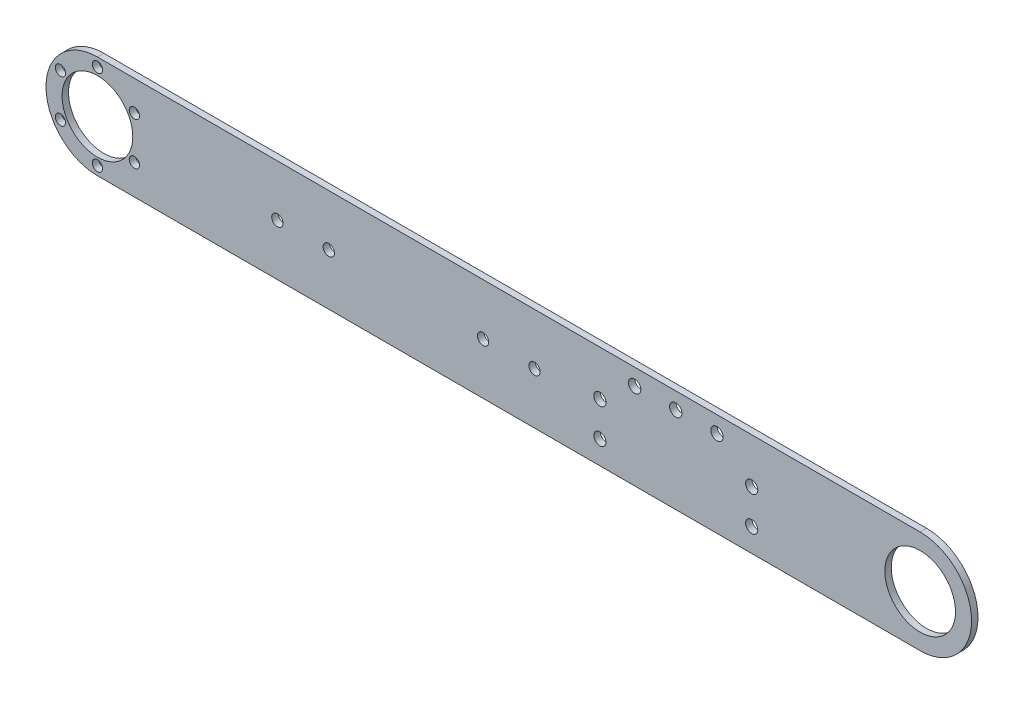
ISO-10303-21;
HEADER;
FILE_DESCRIPTION(('STEP AP214'),'2;1');
FILE_NAME('part.step','',(''),(''),'','','');
FILE_SCHEMA(('AUTOMOTIVE_DESIGN { 1 0 10303 214 1 1 1 1 }'));
ENDSEC;
DATA;
#1=APPLICATION_CONTEXT('core data for automotive mechanical design processes');
#2=APPLICATION_PROTOCOL_DEFINITION('international standard','automotive_design',2000,#1);
#3=PRODUCT_CONTEXT('',#1,'mechanical');
#4=PRODUCT('Part','Part','',(#3));
#5=PRODUCT_RELATED_PRODUCT_CATEGORY('part','',(#4));
#6=PRODUCT_DEFINITION_FORMATION('','',#4);
#7=PRODUCT_DEFINITION_CONTEXT('part definition',#1,'design');
#8=PRODUCT_DEFINITION('design','',#6,#7);
#9=PRODUCT_DEFINITION_SHAPE('','',#8);
#10=(LENGTH_UNIT() NAMED_UNIT(*) SI_UNIT(.MILLI.,.METRE.));
#11=(NAMED_UNIT(*) PLANE_ANGLE_UNIT() SI_UNIT($,.RADIAN.));
#12=(NAMED_UNIT(*) SI_UNIT($,.STERADIAN.) SOLID_ANGLE_UNIT());
#13=UNCERTAINTY_MEASURE_WITH_UNIT(LENGTH_MEASURE(1.E-05),#10,'distance_accuracy_value','');
#14=(GEOMETRIC_REPRESENTATION_CONTEXT(3) GLOBAL_UNCERTAINTY_ASSIGNED_CONTEXT((#13)) GLOBAL_UNIT_ASSIGNED_CONTEXT((#10,
#11,#12)) REPRESENTATION_CONTEXT('',''));
#15=CARTESIAN_POINT('',(0.,0.,0.));
#16=DIRECTION('',(0.,0.,1.));
#17=DIRECTION('',(1.,0.,0.));
#18=AXIS2_PLACEMENT_3D('',#15,#16,#17);
#19=CARTESIAN_POINT('',(0.,25.4,3.175));
#20=DIRECTION('',(0.,0.,-1.));
#21=DIRECTION('',(-1.,0.,0.));
#22=AXIS2_PLACEMENT_3D('',#19,#20,#21);
#23=CYLINDRICAL_SURFACE('',#22,25.4);
#24=CARTESIAN_POINT('',(0.,25.4,0.));
#25=DIRECTION('',(0.,0.,1.));
#26=DIRECTION('',(1.,0.,0.));
#27=AXIS2_PLACEMENT_3D('',#24,#25,#26);
#28=CIRCLE('',#27,25.4);
#29=CARTESIAN_POINT('',(0.,50.8,0.));
#30=VERTEX_POINT('',#29);
#31=CARTESIAN_POINT('',(0.,0.,0.));
#32=VERTEX_POINT('',#31);
#33=EDGE_CURVE('E96',#30,#32,#28,.T.);
#34=ORIENTED_EDGE('',*,*,#33,.T.);
#35=DIRECTION('',(0.,0.,-1.));
#36=VECTOR('',#35,1.);
#37=CARTESIAN_POINT('',(0.,0.,3.175));
#38=LINE('',#37,#36);
#39=CARTESIAN_POINT('',(0.,0.,3.175));
#40=VERTEX_POINT('',#39);
#41=EDGE_CURVE('E11',#40,#32,#38,.T.);
#42=ORIENTED_EDGE('',*,*,#41,.F.);
#43=CARTESIAN_POINT('',(0.,25.4,3.175));
#44=DIRECTION('',(0.,0.,1.));
#45=DIRECTION('',(1.,0.,0.));
#46=AXIS2_PLACEMENT_3D('',#43,#44,#45);
#47=CIRCLE('',#46,25.4);
#48=CARTESIAN_POINT('',(0.,50.8,3.175));
#49=VERTEX_POINT('',#48);
#50=EDGE_CURVE('E84',#49,#40,#47,.T.);
#51=ORIENTED_EDGE('',*,*,#50,.F.);
#52=DIRECTION('',(0.,0.,-1.));
#53=VECTOR('',#52,1.);
#54=CARTESIAN_POINT('',(0.,50.8,3.175));
#55=LINE('',#54,#53);
#56=EDGE_CURVE('E92',#49,#30,#55,.T.);
#57=ORIENTED_EDGE('',*,*,#56,.T.);
#58=EDGE_LOOP('',(#34,#42,#51,#57));
#59=FACE_BOUND('',#58,.T.);
#60=ADVANCED_FACE('F33',(#59),#23,.T.);
#61=CARTESIAN_POINT('',(0.,0.,3.175));
#62=DIRECTION('',(0.,1.,0.));
#63=DIRECTION('',(0.,0.,1.));
#64=AXIS2_PLACEMENT_3D('',#61,#62,#63);
#65=PLANE('',#64);
#66=DIRECTION('',(1.,0.,0.));
#67=VECTOR('',#66,1.);
#68=CARTESIAN_POINT('',(0.,0.,0.));
#69=LINE('',#68,#67);
#70=CARTESIAN_POINT('',(406.4,0.,0.));
#71=VERTEX_POINT('',#70);
#72=EDGE_CURVE('E88',#32,#71,#69,.T.);
#73=ORIENTED_EDGE('',*,*,#72,.T.);
#74=DIRECTION('',(0.,0.,-1.));
#75=VECTOR('',#74,1.);
#76=CARTESIAN_POINT('',(406.4,0.,3.175));
#77=LINE('',#76,#75);
#78=CARTESIAN_POINT('',(406.4,0.,3.175));
#79=VERTEX_POINT('',#78);
#80=EDGE_CURVE('E41',#79,#71,#77,.T.);
#81=ORIENTED_EDGE('',*,*,#80,.F.);
#82=DIRECTION('',(1.,0.,0.));
#83=VECTOR('',#82,1.);
#84=CARTESIAN_POINT('',(0.,0.,3.175));
#85=LINE('',#84,#83);
#86=EDGE_CURVE('E79',#40,#79,#85,.T.);
#87=ORIENTED_EDGE('',*,*,#86,.F.);
#88=ORIENTED_EDGE('',*,*,#41,.T.);
#89=EDGE_LOOP('',(#73,#81,#87,#88));
#90=FACE_BOUND('',#89,.T.);
#91=ADVANCED_FACE('F87',(#90),#65,.F.);
#92=CARTESIAN_POINT('',(406.4,25.4,3.175));
#93=DIRECTION('',(0.,0.,-1.));
#94=DIRECTION('',(-1.,0.,0.));
#95=AXIS2_PLACEMENT_3D('',#92,#93,#94);
#96=CYLINDRICAL_SURFACE('',#95,25.4);
#97=CARTESIAN_POINT('',(406.4,25.4,0.));
#98=DIRECTION('',(0.,0.,1.));
#99=DIRECTION('',(1.,0.,0.));
#100=AXIS2_PLACEMENT_3D('',#97,#98,#99);
#101=CIRCLE('',#100,25.4);
#102=CARTESIAN_POINT('',(406.4,50.8,0.));
#103=VERTEX_POINT('',#102);
#104=EDGE_CURVE('E66',#71,#103,#101,.T.);
#105=ORIENTED_EDGE('',*,*,#104,.T.);
#106=DIRECTION('',(0.,0.,-1.));
#107=VECTOR('',#106,1.);
#108=CARTESIAN_POINT('',(406.4,50.8,3.175));
#109=LINE('',#108,#107);
#110=CARTESIAN_POINT('',(406.4,50.8,3.175));
#111=VERTEX_POINT('',#110);
#112=EDGE_CURVE('E89',#111,#103,#109,.T.);
#113=ORIENTED_EDGE('',*,*,#112,.F.);
#114=CARTESIAN_POINT('',(406.4,25.4,3.175));
#115=DIRECTION('',(0.,0.,1.));
#116=DIRECTION('',(1.,0.,0.));
#117=AXIS2_PLACEMENT_3D('',#114,#115,#116);
#118=CIRCLE('',#117,25.4);
#119=EDGE_CURVE('E82',#79,#111,#118,.T.);
#120=ORIENTED_EDGE('',*,*,#119,.F.);
#121=ORIENTED_EDGE('',*,*,#80,.T.);
#122=EDGE_LOOP('',(#105,#113,#120,#121));
#123=FACE_BOUND('',#122,.T.);
#124=ADVANCED_FACE('F90',(#123),#96,.T.);
#125=CARTESIAN_POINT('',(0.,50.8,3.175));
#126=DIRECTION('',(0.,-1.,0.));
#127=DIRECTION('',(0.,0.,-1.));
#128=AXIS2_PLACEMENT_3D('',#125,#126,#127);
#129=PLANE('',#128);
#130=DIRECTION('',(-1.,0.,0.));
#131=VECTOR('',#130,1.);
#132=CARTESIAN_POINT('',(0.,50.8,0.));
#133=LINE('',#132,#131);
#134=EDGE_CURVE('E72',#103,#30,#133,.T.);
#135=ORIENTED_EDGE('',*,*,#134,.T.);
#136=ORIENTED_EDGE('',*,*,#56,.F.);
#137=DIRECTION('',(-1.,0.,0.));
#138=VECTOR('',#137,1.);
#139=CARTESIAN_POINT('',(0.,50.8,3.175));
#140=LINE('',#139,#138);
#141=EDGE_CURVE('E49',#111,#49,#140,.T.);
#142=ORIENTED_EDGE('',*,*,#141,.F.);
#143=ORIENTED_EDGE('',*,*,#112,.T.);
#144=EDGE_LOOP('',(#135,#136,#142,#143));
#145=FACE_BOUND('',#144,.T.);
#146=ADVANCED_FACE('F104',(#145),#129,.F.);
#147=CARTESIAN_POINT('',(0.,25.4,3.175));
#148=DIRECTION('',(0.,0.,1.));
#149=DIRECTION('',(1.,0.,0.));
#150=AXIS2_PLACEMENT_3D('',#147,#148,#149);
#151=PLANE('',#150);
#152=CARTESIAN_POINT('',(323.195176825481,28.5432896283966,3.175));
#153=DIRECTION('',(0.,0.,1.));
#154=DIRECTION('',(1.,0.,0.));
#155=AXIS2_PLACEMENT_3D('',#152,#153,#154);
#156=CIRCLE('',#155,3.00000000000057);
#157=CARTESIAN_POINT('',(326.195176825481,28.5432896283966,3.175));
#158=VERTEX_POINT('',#157);
#159=EDGE_CURVE('E213',#158,#158,#156,.T.);
#160=ORIENTED_EDGE('',*,*,#159,.F.);
#161=EDGE_LOOP('',(#160));
#162=FACE_BOUND('',#161,.T.);
#163=CARTESIAN_POINT('',(248.195176825481,11.5432896283965,3.175));
#164=DIRECTION('',(0.,0.,1.));
#165=DIRECTION('',(1.,0.,0.));
#166=AXIS2_PLACEMENT_3D('',#163,#164,#165);
#167=CIRCLE('',#166,3.0000000000006);
#168=CARTESIAN_POINT('',(251.195176825481,11.5432896283965,3.175));
#169=VERTEX_POINT('',#168);
#170=EDGE_CURVE('E206',#169,#169,#167,.T.);
#171=ORIENTED_EDGE('',*,*,#170,.F.);
#172=EDGE_LOOP('',(#171));
#173=FACE_BOUND('',#172,.T.);
#174=CARTESIAN_POINT('',(248.195176825486,28.5432896283815,3.175));
#175=DIRECTION('',(0.,0.,1.));
#176=DIRECTION('',(1.,0.,0.));
#177=AXIS2_PLACEMENT_3D('',#174,#175,#176);
#178=CIRCLE('',#177,2.99999999999906);
#179=CARTESIAN_POINT('',(251.195176825485,28.5432896283815,3.175));
#180=VERTEX_POINT('',#179);
#181=EDGE_CURVE('E218',#180,#180,#178,.T.);
#182=ORIENTED_EDGE('',*,*,#181,.F.);
#183=EDGE_LOOP('',(#182));
#184=FACE_BOUND('',#183,.T.);
#185=CARTESIAN_POINT('',(323.195176825481,11.5432896283966,3.175));
#186=DIRECTION('',(0.,0.,1.));
#187=DIRECTION('',(1.,0.,0.));
#188=AXIS2_PLACEMENT_3D('',#185,#186,#187);
#189=CIRCLE('',#188,3.0000000000003);
#190=CARTESIAN_POINT('',(326.195176825481,11.5432896283966,3.175));
#191=VERTEX_POINT('',#190);
#192=EDGE_CURVE('E200',#191,#191,#189,.T.);
#193=ORIENTED_EDGE('',*,*,#192,.F.);
#194=EDGE_LOOP('',(#193));
#195=FACE_BOUND('',#194,.T.);
#196=CARTESIAN_POINT('',(306.015176825481,42.672,3.175));
#197=DIRECTION('',(0.,0.,1.));
#198=DIRECTION('',(1.,0.,0.));
#199=AXIS2_PLACEMENT_3D('',#196,#197,#198);
#200=CIRCLE('',#199,3.04800000000001);
#201=CARTESIAN_POINT('',(309.063176825481,42.672,3.175));
#202=VERTEX_POINT('',#201);
#203=EDGE_CURVE('E195',#202,#202,#200,.T.);
#204=ORIENTED_EDGE('',*,*,#203,.F.);
#205=EDGE_LOOP('',(#204));
#206=FACE_BOUND('',#205,.T.);
#207=CARTESIAN_POINT('',(285.695176825481,42.672,3.175));
#208=DIRECTION('',(0.,0.,1.));
#209=DIRECTION('',(1.,0.,0.));
#210=AXIS2_PLACEMENT_3D('',#207,#208,#209);
#211=CIRCLE('',#210,3.04800000000001);
#212=CARTESIAN_POINT('',(288.743176825481,42.672,3.175));
#213=VERTEX_POINT('',#212);
#214=EDGE_CURVE('E189',#213,#213,#211,.T.);
#215=ORIENTED_EDGE('',*,*,#214,.F.);
#216=EDGE_LOOP('',(#215));
#217=FACE_BOUND('',#216,.T.);
#218=CARTESIAN_POINT('',(265.375176825481,42.672,3.175));
#219=DIRECTION('',(0.,0.,1.));
#220=DIRECTION('',(1.,0.,0.));
#221=AXIS2_PLACEMENT_3D('',#218,#219,#220);
#222=CIRCLE('',#221,3.04800000000001);
#223=CARTESIAN_POINT('',(268.423176825481,42.672,3.175));
#224=VERTEX_POINT('',#223);
#225=EDGE_CURVE('E182',#224,#224,#222,.T.);
#226=ORIENTED_EDGE('',*,*,#225,.F.);
#227=EDGE_LOOP('',(#226));
#228=FACE_BOUND('',#227,.T.);
#229=CARTESIAN_POINT('',(88.9000000000006,25.4000000000066,3.175));
#230=DIRECTION('',(0.,0.,1.));
#231=DIRECTION('',(1.,0.,0.));
#232=AXIS2_PLACEMENT_3D('',#229,#230,#231);
#233=CIRCLE('',#232,2.79399999999336);
#234=CARTESIAN_POINT('',(91.693999999994,25.4000000000066,3.175));
#235=VERTEX_POINT('',#234);
#236=EDGE_CURVE('E177',#235,#235,#233,.T.);
#237=ORIENTED_EDGE('',*,*,#236,.F.);
#238=EDGE_LOOP('',(#237));
#239=FACE_BOUND('',#238,.T.);
#240=CARTESIAN_POINT('',(114.300000000001,25.4000000000066,3.175));
#241=DIRECTION('',(0.,0.,1.));
#242=DIRECTION('',(1.,0.,0.));
#243=AXIS2_PLACEMENT_3D('',#240,#241,#242);
#244=CIRCLE('',#243,2.79399999999335);
#245=CARTESIAN_POINT('',(117.093999999994,25.4000000000066,3.175));
#246=VERTEX_POINT('',#245);
#247=EDGE_CURVE('E171',#246,#246,#244,.T.);
#248=ORIENTED_EDGE('',*,*,#247,.F.);
#249=EDGE_LOOP('',(#248));
#250=FACE_BOUND('',#249,.T.);
#251=CARTESIAN_POINT('',(190.500000000001,25.4000000000066,3.175));
#252=DIRECTION('',(0.,0.,1.));
#253=DIRECTION('',(1.,0.,0.));
#254=AXIS2_PLACEMENT_3D('',#251,#252,#253);
#255=CIRCLE('',#254,2.79399999999332);
#256=CARTESIAN_POINT('',(193.293999999994,25.4000000000066,3.175));
#257=VERTEX_POINT('',#256);
#258=EDGE_CURVE('E165',#257,#257,#255,.T.);
#259=ORIENTED_EDGE('',*,*,#258,.F.);
#260=EDGE_LOOP('',(#259));
#261=FACE_BOUND('',#260,.T.);
#262=CARTESIAN_POINT('',(215.900000000001,25.4000000000066,3.175));
#263=DIRECTION('',(0.,0.,1.));
#264=DIRECTION('',(1.,0.,0.));
#265=AXIS2_PLACEMENT_3D('',#262,#263,#264);
#266=CIRCLE('',#265,2.79399999999332);
#267=CARTESIAN_POINT('',(218.693999999994,25.4000000000066,3.175));
#268=VERTEX_POINT('',#267);
#269=EDGE_CURVE('E158',#268,#268,#266,.T.);
#270=ORIENTED_EDGE('',*,*,#269,.F.);
#271=EDGE_LOOP('',(#270));
#272=FACE_BOUND('',#271,.T.);
#273=CARTESIAN_POINT('',(18.2575475625839,35.9410000000005,3.175));
#274=DIRECTION('',(0.,0.,1.));
#275=DIRECTION('',(1.,0.,0.));
#276=AXIS2_PLACEMENT_3D('',#273,#274,#275);
#277=CIRCLE('',#276,2.55269999999999);
#278=CARTESIAN_POINT('',(20.8102475625838,35.9410000000005,3.175));
#279=VERTEX_POINT('',#278);
#280=EDGE_CURVE('E154',#279,#279,#277,.T.);
#281=ORIENTED_EDGE('',*,*,#280,.F.);
#282=EDGE_LOOP('',(#281));
#283=FACE_BOUND('',#282,.T.);
#284=CARTESIAN_POINT('',(18.2575475625844,14.8590000000004,3.175));
#285=DIRECTION('',(0.,0.,1.));
#286=DIRECTION('',(1.,0.,0.));
#287=AXIS2_PLACEMENT_3D('',#284,#285,#286);
#288=CIRCLE('',#287,2.55269999999999);
#289=CARTESIAN_POINT('',(20.8102475625844,14.8590000000004,3.175));
#290=VERTEX_POINT('',#289);
#291=EDGE_CURVE('E148',#290,#290,#288,.T.);
#292=ORIENTED_EDGE('',*,*,#291,.F.);
#293=EDGE_LOOP('',(#292));
#294=FACE_BOUND('',#293,.T.);
#295=CARTESIAN_POINT('',(1.04083093572472E-12,4.318,3.175));
#296=DIRECTION('',(0.,0.,1.));
#297=DIRECTION('',(1.,0.,0.));
#298=AXIS2_PLACEMENT_3D('',#295,#296,#297);
#299=CIRCLE('',#298,2.55269999999999);
#300=CARTESIAN_POINT('',(2.55270000000103,4.318,3.175));
#301=VERTEX_POINT('',#300);
#302=EDGE_CURVE('E142',#301,#301,#299,.T.);
#303=ORIENTED_EDGE('',*,*,#302,.F.);
#304=EDGE_LOOP('',(#303));
#305=FACE_BOUND('',#304,.T.);
#306=CARTESIAN_POINT('',(-18.2575475625827,14.8589999999997,3.175));
#307=DIRECTION('',(0.,0.,1.));
#308=DIRECTION('',(1.,0.,0.));
#309=AXIS2_PLACEMENT_3D('',#306,#307,#308);
#310=CIRCLE('',#309,2.55269999999999);
#311=CARTESIAN_POINT('',(-15.7048475625828,14.8589999999997,3.175));
#312=VERTEX_POINT('',#311);
#313=EDGE_CURVE('E136',#312,#312,#310,.T.);
#314=ORIENTED_EDGE('',*,*,#313,.F.);
#315=EDGE_LOOP('',(#314));
#316=FACE_BOUND('',#315,.T.);
#317=CARTESIAN_POINT('',(-18.2575475625831,35.9409999999997,3.175));
#318=DIRECTION('',(0.,0.,1.));
#319=DIRECTION('',(1.,0.,0.));
#320=AXIS2_PLACEMENT_3D('',#317,#318,#319);
#321=CIRCLE('',#320,2.55269999999999);
#322=CARTESIAN_POINT('',(-15.7048475625831,35.9409999999997,3.175));
#323=VERTEX_POINT('',#322);
#324=EDGE_CURVE('E130',#323,#323,#321,.T.);
#325=ORIENTED_EDGE('',*,*,#324,.F.);
#326=EDGE_LOOP('',(#325));
#327=FACE_BOUND('',#326,.T.);
#328=CARTESIAN_POINT('',(0.,46.482,3.175));
#329=DIRECTION('',(0.,0.,1.));
#330=DIRECTION('',(1.,0.,0.));
#331=AXIS2_PLACEMENT_3D('',#328,#329,#330);
#332=CIRCLE('',#331,2.55269999999999);
#333=CARTESIAN_POINT('',(2.55269999999999,46.482,3.175));
#334=VERTEX_POINT('',#333);
#335=EDGE_CURVE('E124',#334,#334,#332,.T.);
#336=ORIENTED_EDGE('',*,*,#335,.F.);
#337=EDGE_LOOP('',(#336));
#338=FACE_BOUND('',#337,.T.);
#339=CARTESIAN_POINT('',(0.,25.4,3.175));
#340=DIRECTION('',(0.,0.,1.));
#341=DIRECTION('',(1.,0.,0.));
#342=AXIS2_PLACEMENT_3D('',#339,#340,#341);
#343=CIRCLE('',#342,17.4625);
#344=CARTESIAN_POINT('',(17.4625,25.4,3.175));
#345=VERTEX_POINT('',#344);
#346=EDGE_CURVE('E117',#345,#345,#343,.T.);
#347=ORIENTED_EDGE('',*,*,#346,.F.);
#348=EDGE_LOOP('',(#347));
#349=FACE_BOUND('',#348,.T.);
#350=CARTESIAN_POINT('',(406.4,25.4,3.175));
#351=DIRECTION('',(0.,0.,1.));
#352=DIRECTION('',(1.,0.,0.));
#353=AXIS2_PLACEMENT_3D('',#350,#351,#352);
#354=CIRCLE('',#353,17.4625);
#355=CARTESIAN_POINT('',(423.8625,25.4,3.175));
#356=VERTEX_POINT('',#355);
#357=EDGE_CURVE('E110',#356,#356,#354,.T.);
#358=ORIENTED_EDGE('',*,*,#357,.F.);
#359=EDGE_LOOP('',(#358));
#360=FACE_BOUND('',#359,.T.);
#361=ORIENTED_EDGE('',*,*,#50,.T.);
#362=ORIENTED_EDGE('',*,*,#86,.T.);
#363=ORIENTED_EDGE('',*,*,#119,.T.);
#364=ORIENTED_EDGE('',*,*,#141,.T.);
#365=EDGE_LOOP('',(#361,#362,#363,#364));
#366=FACE_BOUND('',#365,.T.);
#367=ADVANCED_FACE('F80',(#162,#173,#184,#195,#206,#217,#228,#239,#250,#261,#272,#283,#294,#305,
#316,#327,#338,#349,#360,#366),#151,.T.);
#368=CARTESIAN_POINT('',(0.,25.4,0.));
#369=DIRECTION('',(0.,0.,1.));
#370=DIRECTION('',(1.,0.,0.));
#371=AXIS2_PLACEMENT_3D('',#368,#369,#370);
#372=PLANE('',#371);
#373=CARTESIAN_POINT('',(323.195176825481,28.5432896283966,0.));
#374=DIRECTION('',(0.,0.,1.));
#375=DIRECTION('',(1.,0.,0.));
#376=AXIS2_PLACEMENT_3D('',#373,#374,#375);
#377=CIRCLE('',#376,3.00000000000057);
#378=CARTESIAN_POINT('',(326.195176825481,28.5432896283966,0.));
#379=VERTEX_POINT('',#378);
#380=EDGE_CURVE('E203',#379,#379,#377,.T.);
#381=ORIENTED_EDGE('',*,*,#380,.T.);
#382=EDGE_LOOP('',(#381));
#383=FACE_BOUND('',#382,.T.);
#384=CARTESIAN_POINT('',(248.195176825481,11.5432896283965,0.));
#385=DIRECTION('',(0.,0.,1.));
#386=DIRECTION('',(1.,0.,0.));
#387=AXIS2_PLACEMENT_3D('',#384,#385,#386);
#388=CIRCLE('',#387,3.0000000000006);
#389=CARTESIAN_POINT('',(251.195176825481,11.5432896283965,0.));
#390=VERTEX_POINT('',#389);
#391=EDGE_CURVE('E209',#390,#390,#388,.T.);
#392=ORIENTED_EDGE('',*,*,#391,.T.);
#393=EDGE_LOOP('',(#392));
#394=FACE_BOUND('',#393,.T.);
#395=CARTESIAN_POINT('',(248.195176825486,28.5432896283815,0.));
#396=DIRECTION('',(0.,0.,1.));
#397=DIRECTION('',(1.,0.,0.));
#398=AXIS2_PLACEMENT_3D('',#395,#396,#397);
#399=CIRCLE('',#398,2.99999999999906);
#400=CARTESIAN_POINT('',(251.195176825485,28.5432896283815,0.));
#401=VERTEX_POINT('',#400);
#402=EDGE_CURVE('E210',#401,#401,#399,.T.);
#403=ORIENTED_EDGE('',*,*,#402,.T.);
#404=EDGE_LOOP('',(#403));
#405=FACE_BOUND('',#404,.T.);
#406=CARTESIAN_POINT('',(323.195176825481,11.5432896283966,0.));
#407=DIRECTION('',(0.,0.,1.));
#408=DIRECTION('',(1.,0.,0.));
#409=AXIS2_PLACEMENT_3D('',#406,#407,#408);
#410=CIRCLE('',#409,3.0000000000003);
#411=CARTESIAN_POINT('',(326.195176825481,11.5432896283966,0.));
#412=VERTEX_POINT('',#411);
#413=EDGE_CURVE('E186',#412,#412,#410,.T.);
#414=ORIENTED_EDGE('',*,*,#413,.T.);
#415=EDGE_LOOP('',(#414));
#416=FACE_BOUND('',#415,.T.);
#417=CARTESIAN_POINT('',(306.015176825481,42.672,0.));
#418=DIRECTION('',(0.,0.,1.));
#419=DIRECTION('',(1.,0.,0.));
#420=AXIS2_PLACEMENT_3D('',#417,#418,#419);
#421=CIRCLE('',#420,3.04800000000001);
#422=CARTESIAN_POINT('',(309.063176825481,42.672,0.));
#423=VERTEX_POINT('',#422);
#424=EDGE_CURVE('E162',#423,#423,#421,.T.);
#425=ORIENTED_EDGE('',*,*,#424,.T.);
#426=EDGE_LOOP('',(#425));
#427=FACE_BOUND('',#426,.T.);
#428=CARTESIAN_POINT('',(285.695176825481,42.672,0.));
#429=DIRECTION('',(0.,0.,1.));
#430=DIRECTION('',(1.,0.,0.));
#431=AXIS2_PLACEMENT_3D('',#428,#429,#430);
#432=CIRCLE('',#431,3.04800000000001);
#433=CARTESIAN_POINT('',(288.743176825481,42.672,0.));
#434=VERTEX_POINT('',#433);
#435=EDGE_CURVE('E192',#434,#434,#432,.T.);
#436=ORIENTED_EDGE('',*,*,#435,.T.);
#437=EDGE_LOOP('',(#436));
#438=FACE_BOUND('',#437,.T.);
#439=CARTESIAN_POINT('',(265.375176825481,42.672,0.));
#440=DIRECTION('',(0.,0.,1.));
#441=DIRECTION('',(1.,0.,0.));
#442=AXIS2_PLACEMENT_3D('',#439,#440,#441);
#443=CIRCLE('',#442,3.04800000000001);
#444=CARTESIAN_POINT('',(268.423176825481,42.672,0.));
#445=VERTEX_POINT('',#444);
#446=EDGE_CURVE('E185',#445,#445,#443,.T.);
#447=ORIENTED_EDGE('',*,*,#446,.T.);
#448=EDGE_LOOP('',(#447));
#449=FACE_BOUND('',#448,.T.);
#450=CARTESIAN_POINT('',(88.9000000000006,25.4000000000066,0.));
#451=DIRECTION('',(0.,0.,1.));
#452=DIRECTION('',(1.,0.,0.));
#453=AXIS2_PLACEMENT_3D('',#450,#451,#452);
#454=CIRCLE('',#453,2.79399999999336);
#455=CARTESIAN_POINT('',(91.693999999994,25.4000000000066,0.));
#456=VERTEX_POINT('',#455);
#457=EDGE_CURVE('E157',#456,#456,#454,.T.);
#458=ORIENTED_EDGE('',*,*,#457,.T.);
#459=EDGE_LOOP('',(#458));
#460=FACE_BOUND('',#459,.T.);
#461=CARTESIAN_POINT('',(114.300000000001,25.4000000000066,0.));
#462=DIRECTION('',(0.,0.,1.));
#463=DIRECTION('',(1.,0.,0.));
#464=AXIS2_PLACEMENT_3D('',#461,#462,#463);
#465=CIRCLE('',#464,2.79399999999335);
#466=CARTESIAN_POINT('',(117.093999999994,25.4000000000066,0.));
#467=VERTEX_POINT('',#466);
#468=EDGE_CURVE('E174',#467,#467,#465,.T.);
#469=ORIENTED_EDGE('',*,*,#468,.T.);
#470=EDGE_LOOP('',(#469));
#471=FACE_BOUND('',#470,.T.);
#472=CARTESIAN_POINT('',(190.500000000001,25.4000000000066,0.));
#473=DIRECTION('',(0.,0.,1.));
#474=DIRECTION('',(1.,0.,0.));
#475=AXIS2_PLACEMENT_3D('',#472,#473,#474);
#476=CIRCLE('',#475,2.79399999999332);
#477=CARTESIAN_POINT('',(193.293999999994,25.4000000000066,0.));
#478=VERTEX_POINT('',#477);
#479=EDGE_CURVE('E168',#478,#478,#476,.T.);
#480=ORIENTED_EDGE('',*,*,#479,.T.);
#481=EDGE_LOOP('',(#480));
#482=FACE_BOUND('',#481,.T.);
#483=CARTESIAN_POINT('',(215.900000000001,25.4000000000066,0.));
#484=DIRECTION('',(0.,0.,1.));
#485=DIRECTION('',(1.,0.,0.));
#486=AXIS2_PLACEMENT_3D('',#483,#484,#485);
#487=CIRCLE('',#486,2.79399999999332);
#488=CARTESIAN_POINT('',(218.693999999994,25.4000000000066,0.));
#489=VERTEX_POINT('',#488);
#490=EDGE_CURVE('E161',#489,#489,#487,.T.);
#491=ORIENTED_EDGE('',*,*,#490,.T.);
#492=EDGE_LOOP('',(#491));
#493=FACE_BOUND('',#492,.T.);
#494=CARTESIAN_POINT('',(18.2575475625839,35.9410000000005,0.));
#495=DIRECTION('',(0.,0.,1.));
#496=DIRECTION('',(1.,0.,0.));
#497=AXIS2_PLACEMENT_3D('',#494,#495,#496);
#498=CIRCLE('',#497,2.5527);
#499=CARTESIAN_POINT('',(20.8102475625839,35.9410000000005,0.));
#500=VERTEX_POINT('',#499);
#501=EDGE_CURVE('E151',#500,#500,#498,.T.);
#502=ORIENTED_EDGE('',*,*,#501,.T.);
#503=EDGE_LOOP('',(#502));
#504=FACE_BOUND('',#503,.T.);
#505=CARTESIAN_POINT('',(18.2575475625844,14.8590000000004,0.));
#506=DIRECTION('',(0.,0.,1.));
#507=DIRECTION('',(1.,0.,0.));
#508=AXIS2_PLACEMENT_3D('',#505,#506,#507);
#509=CIRCLE('',#508,2.5527);
#510=CARTESIAN_POINT('',(20.8102475625844,14.8590000000004,0.));
#511=VERTEX_POINT('',#510);
#512=EDGE_CURVE('E145',#511,#511,#509,.T.);
#513=ORIENTED_EDGE('',*,*,#512,.T.);
#514=EDGE_LOOP('',(#513));
#515=FACE_BOUND('',#514,.T.);
#516=CARTESIAN_POINT('',(1.04083093572472E-12,4.318,0.));
#517=DIRECTION('',(0.,0.,1.));
#518=DIRECTION('',(1.,0.,0.));
#519=AXIS2_PLACEMENT_3D('',#516,#517,#518);
#520=CIRCLE('',#519,2.5527);
#521=CARTESIAN_POINT('',(2.55270000000104,4.318,0.));
#522=VERTEX_POINT('',#521);
#523=EDGE_CURVE('E139',#522,#522,#520,.T.);
#524=ORIENTED_EDGE('',*,*,#523,.T.);
#525=EDGE_LOOP('',(#524));
#526=FACE_BOUND('',#525,.T.);
#527=CARTESIAN_POINT('',(-18.2575475625827,14.8589999999997,0.));
#528=DIRECTION('',(0.,0.,1.));
#529=DIRECTION('',(1.,0.,0.));
#530=AXIS2_PLACEMENT_3D('',#527,#528,#529);
#531=CIRCLE('',#530,2.5527);
#532=CARTESIAN_POINT('',(-15.7048475625827,14.8589999999997,0.));
#533=VERTEX_POINT('',#532);
#534=EDGE_CURVE('E133',#533,#533,#531,.T.);
#535=ORIENTED_EDGE('',*,*,#534,.T.);
#536=EDGE_LOOP('',(#535));
#537=FACE_BOUND('',#536,.T.);
#538=CARTESIAN_POINT('',(-18.2575475625831,35.9409999999997,0.));
#539=DIRECTION('',(0.,0.,1.));
#540=DIRECTION('',(1.,0.,0.));
#541=AXIS2_PLACEMENT_3D('',#538,#539,#540);
#542=CIRCLE('',#541,2.5527);
#543=CARTESIAN_POINT('',(-15.7048475625831,35.9409999999997,0.));
#544=VERTEX_POINT('',#543);
#545=EDGE_CURVE('E127',#544,#544,#542,.T.);
#546=ORIENTED_EDGE('',*,*,#545,.T.);
#547=EDGE_LOOP('',(#546));
#548=FACE_BOUND('',#547,.T.);
#549=CARTESIAN_POINT('',(0.,46.482,0.));
#550=DIRECTION('',(0.,0.,1.));
#551=DIRECTION('',(1.,0.,0.));
#552=AXIS2_PLACEMENT_3D('',#549,#550,#551);
#553=CIRCLE('',#552,2.5527);
#554=CARTESIAN_POINT('',(2.5527,46.482,0.));
#555=VERTEX_POINT('',#554);
#556=EDGE_CURVE('E114',#555,#555,#553,.T.);
#557=ORIENTED_EDGE('',*,*,#556,.T.);
#558=EDGE_LOOP('',(#557));
#559=FACE_BOUND('',#558,.T.);
#560=CARTESIAN_POINT('',(0.,25.4,0.));
#561=DIRECTION('',(0.,0.,1.));
#562=DIRECTION('',(1.,0.,0.));
#563=AXIS2_PLACEMENT_3D('',#560,#561,#562);
#564=CIRCLE('',#563,17.4625);
#565=CARTESIAN_POINT('',(17.4625,25.4,0.));
#566=VERTEX_POINT('',#565);
#567=EDGE_CURVE('E99',#566,#566,#564,.T.);
#568=ORIENTED_EDGE('',*,*,#567,.T.);
#569=EDGE_LOOP('',(#568));
#570=FACE_BOUND('',#569,.T.);
#571=CARTESIAN_POINT('',(406.4,25.4,0.));
#572=DIRECTION('',(0.,0.,1.));
#573=DIRECTION('',(1.,0.,0.));
#574=AXIS2_PLACEMENT_3D('',#571,#572,#573);
#575=CIRCLE('',#574,17.4625);
#576=CARTESIAN_POINT('',(423.8625,25.4,0.));
#577=VERTEX_POINT('',#576);
#578=EDGE_CURVE('E113',#577,#577,#575,.T.);
#579=ORIENTED_EDGE('',*,*,#578,.T.);
#580=EDGE_LOOP('',(#579));
#581=FACE_BOUND('',#580,.T.);
#582=ORIENTED_EDGE('',*,*,#33,.F.);
#583=ORIENTED_EDGE('',*,*,#134,.F.);
#584=ORIENTED_EDGE('',*,*,#104,.F.);
#585=ORIENTED_EDGE('',*,*,#72,.F.);
#586=EDGE_LOOP('',(#582,#583,#584,#585));
#587=FACE_BOUND('',#586,.T.);
#588=ADVANCED_FACE('F107',(#383,#394,#405,#416,#427,#438,#449,#460,#471,#482,#493,#504,#515,
#526,#537,#548,#559,#570,#581,#587),#372,.F.);
#589=CARTESIAN_POINT('',(406.4,25.4,0.));
#590=DIRECTION('',(0.,0.,1.));
#591=DIRECTION('',(1.,0.,0.));
#592=AXIS2_PLACEMENT_3D('',#589,#590,#591);
#593=CYLINDRICAL_SURFACE('',#592,17.4625);
#594=ORIENTED_EDGE('',*,*,#578,.F.);
#595=EDGE_LOOP('',(#594));
#596=FACE_BOUND('',#595,.T.);
#597=ORIENTED_EDGE('',*,*,#357,.T.);
#598=EDGE_LOOP('',(#597));
#599=FACE_BOUND('',#598,.T.);
#600=ADVANCED_FACE('F270',(#596,#599),#593,.F.);
#601=CARTESIAN_POINT('',(0.,25.4,0.));
#602=DIRECTION('',(0.,0.,1.));
#603=DIRECTION('',(1.,0.,0.));
#604=AXIS2_PLACEMENT_3D('',#601,#602,#603);
#605=CYLINDRICAL_SURFACE('',#604,17.4625);
#606=ORIENTED_EDGE('',*,*,#567,.F.);
#607=EDGE_LOOP('',(#606));
#608=FACE_BOUND('',#607,.T.);
#609=ORIENTED_EDGE('',*,*,#346,.T.);
#610=EDGE_LOOP('',(#609));
#611=FACE_BOUND('',#610,.T.);
#612=ADVANCED_FACE('F272',(#608,#611),#605,.F.);
#613=CARTESIAN_POINT('',(0.,46.482,3.175));
#614=DIRECTION('',(0.,0.,1.));
#615=DIRECTION('',(1.,0.,0.));
#616=AXIS2_PLACEMENT_3D('',#613,#614,#615);
#617=CYLINDRICAL_SURFACE('',#616,2.55269999999999);
#618=ORIENTED_EDGE('',*,*,#556,.F.);
#619=EDGE_LOOP('',(#618));
#620=FACE_BOUND('',#619,.T.);
#621=ORIENTED_EDGE('',*,*,#335,.T.);
#622=EDGE_LOOP('',(#621));
#623=FACE_BOUND('',#622,.T.);
#624=ADVANCED_FACE('F279',(#620,#623),#617,.F.);
#625=CARTESIAN_POINT('',(-18.2575475625831,35.9409999999997,3.175));
#626=DIRECTION('',(0.,0.,1.));
#627=DIRECTION('',(1.,0.,0.));
#628=AXIS2_PLACEMENT_3D('',#625,#626,#627);
#629=CYLINDRICAL_SURFACE('',#628,2.55269999999999);
#630=ORIENTED_EDGE('',*,*,#545,.F.);
#631=EDGE_LOOP('',(#630));
#632=FACE_BOUND('',#631,.T.);
#633=ORIENTED_EDGE('',*,*,#324,.T.);
#634=EDGE_LOOP('',(#633));
#635=FACE_BOUND('',#634,.T.);
#636=ADVANCED_FACE('F394',(#632,#635),#629,.F.);
#637=CARTESIAN_POINT('',(-18.2575475625827,14.8589999999997,3.175));
#638=DIRECTION('',(0.,0.,1.));
#639=DIRECTION('',(1.,0.,0.));
#640=AXIS2_PLACEMENT_3D('',#637,#638,#639);
#641=CYLINDRICAL_SURFACE('',#640,2.55269999999999);
#642=ORIENTED_EDGE('',*,*,#534,.F.);
#643=EDGE_LOOP('',(#642));
#644=FACE_BOUND('',#643,.T.);
#645=ORIENTED_EDGE('',*,*,#313,.T.);
#646=EDGE_LOOP('',(#645));
#647=FACE_BOUND('',#646,.T.);
#648=ADVANCED_FACE('F390',(#644,#647),#641,.F.);
#649=CARTESIAN_POINT('',(1.04083093572472E-12,4.318,3.175));
#650=DIRECTION('',(0.,0.,1.));
#651=DIRECTION('',(1.,0.,0.));
#652=AXIS2_PLACEMENT_3D('',#649,#650,#651);
#653=CYLINDRICAL_SURFACE('',#652,2.55269999999999);
#654=ORIENTED_EDGE('',*,*,#523,.F.);
#655=EDGE_LOOP('',(#654));
#656=FACE_BOUND('',#655,.T.);
#657=ORIENTED_EDGE('',*,*,#302,.T.);
#658=EDGE_LOOP('',(#657));
#659=FACE_BOUND('',#658,.T.);
#660=ADVANCED_FACE('F386',(#656,#659),#653,.F.);
#661=CARTESIAN_POINT('',(18.2575475625844,14.8590000000004,3.175));
#662=DIRECTION('',(0.,0.,1.));
#663=DIRECTION('',(1.,0.,0.));
#664=AXIS2_PLACEMENT_3D('',#661,#662,#663);
#665=CYLINDRICAL_SURFACE('',#664,2.55269999999999);
#666=ORIENTED_EDGE('',*,*,#512,.F.);
#667=EDGE_LOOP('',(#666));
#668=FACE_BOUND('',#667,.T.);
#669=ORIENTED_EDGE('',*,*,#291,.T.);
#670=EDGE_LOOP('',(#669));
#671=FACE_BOUND('',#670,.T.);
#672=ADVANCED_FACE('F382',(#668,#671),#665,.F.);
#673=CARTESIAN_POINT('',(18.2575475625839,35.9410000000005,3.175));
#674=DIRECTION('',(0.,0.,1.));
#675=DIRECTION('',(1.,0.,0.));
#676=AXIS2_PLACEMENT_3D('',#673,#674,#675);
#677=CYLINDRICAL_SURFACE('',#676,2.55269999999999);
#678=ORIENTED_EDGE('',*,*,#501,.F.);
#679=EDGE_LOOP('',(#678));
#680=FACE_BOUND('',#679,.T.);
#681=ORIENTED_EDGE('',*,*,#280,.T.);
#682=EDGE_LOOP('',(#681));
#683=FACE_BOUND('',#682,.T.);
#684=ADVANCED_FACE('F378',(#680,#683),#677,.F.);
#685=CARTESIAN_POINT('',(215.900000000001,25.4000000000066,0.));
#686=DIRECTION('',(0.,0.,1.));
#687=DIRECTION('',(1.,0.,0.));
#688=AXIS2_PLACEMENT_3D('',#685,#686,#687);
#689=CYLINDRICAL_SURFACE('',#688,2.79399999999332);
#690=ORIENTED_EDGE('',*,*,#490,.F.);
#691=EDGE_LOOP('',(#690));
#692=FACE_BOUND('',#691,.T.);
#693=ORIENTED_EDGE('',*,*,#269,.T.);
#694=EDGE_LOOP('',(#693));
#695=FACE_BOUND('',#694,.T.);
#696=ADVANCED_FACE('F374',(#692,#695),#689,.F.);
#697=CARTESIAN_POINT('',(190.500000000001,25.4000000000066,0.));
#698=DIRECTION('',(0.,0.,1.));
#699=DIRECTION('',(1.,0.,0.));
#700=AXIS2_PLACEMENT_3D('',#697,#698,#699);
#701=CYLINDRICAL_SURFACE('',#700,2.79399999999332);
#702=ORIENTED_EDGE('',*,*,#479,.F.);
#703=EDGE_LOOP('',(#702));
#704=FACE_BOUND('',#703,.T.);
#705=ORIENTED_EDGE('',*,*,#258,.T.);
#706=EDGE_LOOP('',(#705));
#707=FACE_BOUND('',#706,.T.);
#708=ADVANCED_FACE('F370',(#704,#707),#701,.F.);
#709=CARTESIAN_POINT('',(114.300000000001,25.4000000000066,0.));
#710=DIRECTION('',(0.,0.,1.));
#711=DIRECTION('',(1.,0.,0.));
#712=AXIS2_PLACEMENT_3D('',#709,#710,#711);
#713=CYLINDRICAL_SURFACE('',#712,2.79399999999335);
#714=ORIENTED_EDGE('',*,*,#468,.F.);
#715=EDGE_LOOP('',(#714));
#716=FACE_BOUND('',#715,.T.);
#717=ORIENTED_EDGE('',*,*,#247,.T.);
#718=EDGE_LOOP('',(#717));
#719=FACE_BOUND('',#718,.T.);
#720=ADVANCED_FACE('F366',(#716,#719),#713,.F.);
#721=CARTESIAN_POINT('',(88.9000000000006,25.4000000000066,0.));
#722=DIRECTION('',(0.,0.,1.));
#723=DIRECTION('',(1.,0.,0.));
#724=AXIS2_PLACEMENT_3D('',#721,#722,#723);
#725=CYLINDRICAL_SURFACE('',#724,2.79399999999336);
#726=ORIENTED_EDGE('',*,*,#457,.F.);
#727=EDGE_LOOP('',(#726));
#728=FACE_BOUND('',#727,.T.);
#729=ORIENTED_EDGE('',*,*,#236,.T.);
#730=EDGE_LOOP('',(#729));
#731=FACE_BOUND('',#730,.T.);
#732=ADVANCED_FACE('F362',(#728,#731),#725,.F.);
#733=CARTESIAN_POINT('',(265.375176825481,42.672,0.));
#734=DIRECTION('',(0.,0.,1.));
#735=DIRECTION('',(1.,0.,0.));
#736=AXIS2_PLACEMENT_3D('',#733,#734,#735);
#737=CYLINDRICAL_SURFACE('',#736,3.04800000000001);
#738=ORIENTED_EDGE('',*,*,#446,.F.);
#739=EDGE_LOOP('',(#738));
#740=FACE_BOUND('',#739,.T.);
#741=ORIENTED_EDGE('',*,*,#225,.T.);
#742=EDGE_LOOP('',(#741));
#743=FACE_BOUND('',#742,.T.);
#744=ADVANCED_FACE('F358',(#740,#743),#737,.F.);
#745=CARTESIAN_POINT('',(285.695176825481,42.672,0.));
#746=DIRECTION('',(0.,0.,1.));
#747=DIRECTION('',(1.,0.,0.));
#748=AXIS2_PLACEMENT_3D('',#745,#746,#747);
#749=CYLINDRICAL_SURFACE('',#748,3.04800000000001);
#750=ORIENTED_EDGE('',*,*,#435,.F.);
#751=EDGE_LOOP('',(#750));
#752=FACE_BOUND('',#751,.T.);
#753=ORIENTED_EDGE('',*,*,#214,.T.);
#754=EDGE_LOOP('',(#753));
#755=FACE_BOUND('',#754,.T.);
#756=ADVANCED_FACE('F354',(#752,#755),#749,.F.);
#757=CARTESIAN_POINT('',(306.015176825481,42.672,0.));
#758=DIRECTION('',(0.,0.,1.));
#759=DIRECTION('',(1.,0.,0.));
#760=AXIS2_PLACEMENT_3D('',#757,#758,#759);
#761=CYLINDRICAL_SURFACE('',#760,3.04800000000001);
#762=ORIENTED_EDGE('',*,*,#424,.F.);
#763=EDGE_LOOP('',(#762));
#764=FACE_BOUND('',#763,.T.);
#765=ORIENTED_EDGE('',*,*,#203,.T.);
#766=EDGE_LOOP('',(#765));
#767=FACE_BOUND('',#766,.T.);
#768=ADVANCED_FACE('F318',(#764,#767),#761,.F.);
#769=CARTESIAN_POINT('',(323.195176825481,11.5432896283966,0.));
#770=DIRECTION('',(0.,0.,1.));
#771=DIRECTION('',(1.,0.,0.));
#772=AXIS2_PLACEMENT_3D('',#769,#770,#771);
#773=CYLINDRICAL_SURFACE('',#772,3.0000000000003);
#774=ORIENTED_EDGE('',*,*,#413,.F.);
#775=EDGE_LOOP('',(#774));
#776=FACE_BOUND('',#775,.T.);
#777=ORIENTED_EDGE('',*,*,#192,.T.);
#778=EDGE_LOOP('',(#777));
#779=FACE_BOUND('',#778,.T.);
#780=ADVANCED_FACE('F230',(#776,#779),#773,.F.);
#781=CARTESIAN_POINT('',(248.195176825486,28.5432896283815,0.));
#782=DIRECTION('',(0.,0.,1.));
#783=DIRECTION('',(1.,0.,0.));
#784=AXIS2_PLACEMENT_3D('',#781,#782,#783);
#785=CYLINDRICAL_SURFACE('',#784,2.99999999999906);
#786=ORIENTED_EDGE('',*,*,#402,.F.);
#787=EDGE_LOOP('',(#786));
#788=FACE_BOUND('',#787,.T.);
#789=ORIENTED_EDGE('',*,*,#181,.T.);
#790=EDGE_LOOP('',(#789));
#791=FACE_BOUND('',#790,.T.);
#792=ADVANCED_FACE('F226',(#788,#791),#785,.F.);
#793=CARTESIAN_POINT('',(248.195176825481,11.5432896283965,0.));
#794=DIRECTION('',(0.,0.,1.));
#795=DIRECTION('',(1.,0.,0.));
#796=AXIS2_PLACEMENT_3D('',#793,#794,#795);
#797=CYLINDRICAL_SURFACE('',#796,3.0000000000006);
#798=ORIENTED_EDGE('',*,*,#391,.F.);
#799=EDGE_LOOP('',(#798));
#800=FACE_BOUND('',#799,.T.);
#801=ORIENTED_EDGE('',*,*,#170,.T.);
#802=EDGE_LOOP('',(#801));
#803=FACE_BOUND('',#802,.T.);
#804=ADVANCED_FACE('F229',(#800,#803),#797,.F.);
#805=CARTESIAN_POINT('',(323.195176825481,28.5432896283966,0.));
#806=DIRECTION('',(0.,0.,1.));
#807=DIRECTION('',(1.,0.,0.));
#808=AXIS2_PLACEMENT_3D('',#805,#806,#807);
#809=CYLINDRICAL_SURFACE('',#808,3.00000000000057);
#810=ORIENTED_EDGE('',*,*,#380,.F.);
#811=EDGE_LOOP('',(#810));
#812=FACE_BOUND('',#811,.T.);
#813=ORIENTED_EDGE('',*,*,#159,.T.);
#814=EDGE_LOOP('',(#813));
#815=FACE_BOUND('',#814,.T.);
#816=ADVANCED_FACE('F336',(#812,#815),#809,.F.);
#817=CLOSED_SHELL('',(#60,#91,#124,#146,#367,#588,#600,#612,#624,#636,#648,#660,#672,#684,#696,
#708,#720,#732,#744,#756,#768,#780,#792,#804,#816));
#818=MANIFOLD_SOLID_BREP('B2',#817);
#819=ADVANCED_BREP_SHAPE_REPRESENTATION('',(#18,#818),#14);
#820=SHAPE_DEFINITION_REPRESENTATION(#9,#819);
ENDSEC;
END-ISO-10303-21;
